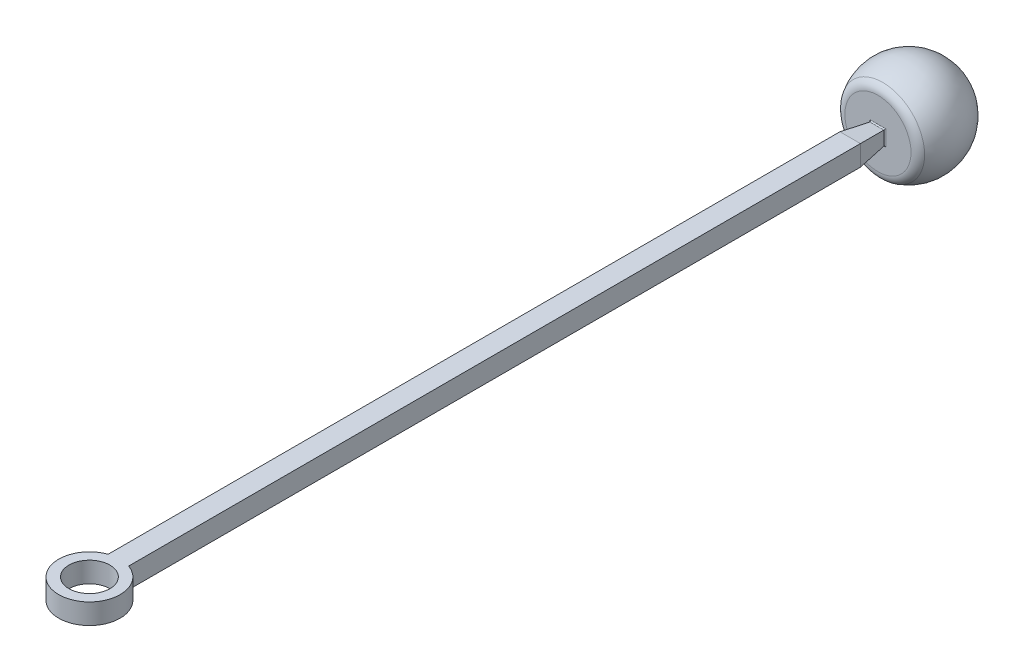
ISO-10303-21;
HEADER;
FILE_DESCRIPTION(('STEP AP214'),'2;1');
FILE_NAME('part.step','',(''),(''),'','','');
FILE_SCHEMA(('AUTOMOTIVE_DESIGN { 1 0 10303 214 1 1 1 1 }'));
ENDSEC;
DATA;
#1=APPLICATION_CONTEXT('core data for automotive mechanical design processes');
#2=APPLICATION_PROTOCOL_DEFINITION('international standard','automotive_design',2000,#1);
#3=PRODUCT_CONTEXT('',#1,'mechanical');
#4=PRODUCT('Part','Part','',(#3));
#5=PRODUCT_RELATED_PRODUCT_CATEGORY('part','',(#4));
#6=PRODUCT_DEFINITION_FORMATION('','',#4);
#7=PRODUCT_DEFINITION_CONTEXT('part definition',#1,'design');
#8=PRODUCT_DEFINITION('design','',#6,#7);
#9=PRODUCT_DEFINITION_SHAPE('','',#8);
#10=(LENGTH_UNIT() NAMED_UNIT(*) SI_UNIT(.MILLI.,.METRE.));
#11=(NAMED_UNIT(*) PLANE_ANGLE_UNIT() SI_UNIT($,.RADIAN.));
#12=(NAMED_UNIT(*) SI_UNIT($,.STERADIAN.) SOLID_ANGLE_UNIT());
#13=UNCERTAINTY_MEASURE_WITH_UNIT(LENGTH_MEASURE(1.E-05),#10,'distance_accuracy_value','');
#14=(GEOMETRIC_REPRESENTATION_CONTEXT(3) GLOBAL_UNCERTAINTY_ASSIGNED_CONTEXT((#13)) GLOBAL_UNIT_ASSIGNED_CONTEXT((#10,
#11,#12)) REPRESENTATION_CONTEXT('',''));
#15=CARTESIAN_POINT('',(0.,0.,0.));
#16=DIRECTION('',(0.,0.,1.));
#17=DIRECTION('',(1.,0.,0.));
#18=AXIS2_PLACEMENT_3D('',#15,#16,#17);
#19=CARTESIAN_POINT('',(5.,-5.,400.));
#20=DIRECTION('',(-1.,0.,0.));
#21=DIRECTION('',(0.,0.,1.));
#22=AXIS2_PLACEMENT_3D('',#19,#20,#21);
#23=PLANE('',#22);
#24=DIRECTION('',(0.,0.,-1.));
#25=VECTOR('',#24,1.);
#26=CARTESIAN_POINT('',(5.,-5.,400.));
#27=LINE('',#26,#25);
#28=CARTESIAN_POINT('',(5.,-5.,385.857864376269));
#29=VERTEX_POINT('',#28);
#30=CARTESIAN_POINT('',(5.,-5.,28.5603368025777));
#31=VERTEX_POINT('',#30);
#32=EDGE_CURVE('E137',#29,#31,#27,.T.);
#33=ORIENTED_EDGE('',*,*,#32,.T.);
#34=DIRECTION('',(0.,1.,0.));
#35=VECTOR('',#34,1.);
#36=CARTESIAN_POINT('',(5.,-5.,28.5603368025777));
#37=LINE('',#36,#35);
#38=CARTESIAN_POINT('',(5.,5.,28.5603368025777));
#39=VERTEX_POINT('',#38);
#40=EDGE_CURVE('E130',#31,#39,#37,.T.);
#41=ORIENTED_EDGE('',*,*,#40,.T.);
#42=DIRECTION('',(0.,0.,-1.));
#43=VECTOR('',#42,1.);
#44=CARTESIAN_POINT('',(5.,5.,400.));
#45=LINE('',#44,#43);
#46=CARTESIAN_POINT('',(5.,5.,385.857864376269));
#47=VERTEX_POINT('',#46);
#48=EDGE_CURVE('E116',#47,#39,#45,.T.);
#49=ORIENTED_EDGE('',*,*,#48,.F.);
#50=DIRECTION('',(0.,1.,0.));
#51=VECTOR('',#50,1.);
#52=CARTESIAN_POINT('',(5.,-47.4264068711929,385.857864376269));
#53=LINE('',#52,#51);
#54=EDGE_CURVE('E140',#47,#29,#53,.F.);
#55=ORIENTED_EDGE('',*,*,#54,.T.);
#56=EDGE_LOOP('',(#33,#41,#49,#55));
#57=FACE_BOUND('',#56,.T.);
#58=ADVANCED_FACE('F37',(#57),#23,.F.);
#59=CARTESIAN_POINT('',(-5.,5.,400.));
#60=DIRECTION('',(0.,-1.,0.));
#61=DIRECTION('',(0.,0.,-1.));
#62=AXIS2_PLACEMENT_3D('',#59,#60,#61);
#63=PLANE('',#62);
#64=CARTESIAN_POINT('',(0.,5.,400.));
#65=DIRECTION('',(0.,1.,0.));
#66=DIRECTION('',(0.,0.,1.));
#67=AXIS2_PLACEMENT_3D('',#64,#65,#66);
#68=CIRCLE('',#67,10.);
#69=CARTESIAN_POINT('',(0.,5.,410.));
#70=VERTEX_POINT('',#69);
#71=EDGE_CURVE('E233',#70,#70,#68,.T.);
#72=ORIENTED_EDGE('',*,*,#71,.F.);
#73=EDGE_LOOP('',(#72));
#74=FACE_BOUND('',#73,.T.);
#75=ORIENTED_EDGE('',*,*,#48,.T.);
#76=DIRECTION('',(-1.,0.,0.));
#77=VECTOR('',#76,1.);
#78=CARTESIAN_POINT('',(-5.,5.,28.5603368025777));
#79=LINE('',#78,#77);
#80=CARTESIAN_POINT('',(-5.,5.,28.5603368025777));
#81=VERTEX_POINT('',#80);
#82=EDGE_CURVE('E230',#39,#81,#79,.T.);
#83=ORIENTED_EDGE('',*,*,#82,.T.);
#84=DIRECTION('',(0.,0.,-1.));
#85=VECTOR('',#84,1.);
#86=CARTESIAN_POINT('',(-5.,5.,400.));
#87=LINE('',#86,#85);
#88=CARTESIAN_POINT('',(-5.,5.,385.857864376269));
#89=VERTEX_POINT('',#88);
#90=EDGE_CURVE('E129',#89,#81,#87,.T.);
#91=ORIENTED_EDGE('',*,*,#90,.F.);
#92=CARTESIAN_POINT('',(0.,5.,400.));
#93=DIRECTION('',(0.,1.,0.));
#94=DIRECTION('',(0.,0.,1.));
#95=AXIS2_PLACEMENT_3D('',#92,#93,#94);
#96=CIRCLE('',#95,15.);
#97=EDGE_CURVE('E239',#89,#47,#96,.T.);
#98=ORIENTED_EDGE('',*,*,#97,.T.);
#99=EDGE_LOOP('',(#75,#83,#91,#98));
#100=FACE_BOUND('',#99,.T.);
#101=ADVANCED_FACE('F187',(#74,#100),#63,.F.);
#102=CARTESIAN_POINT('',(-5.,-5.,400.));
#103=DIRECTION('',(1.,0.,0.));
#104=DIRECTION('',(0.,0.,-1.));
#105=AXIS2_PLACEMENT_3D('',#102,#103,#104);
#106=PLANE('',#105);
#107=ORIENTED_EDGE('',*,*,#90,.T.);
#108=DIRECTION('',(0.,-1.,0.));
#109=VECTOR('',#108,1.);
#110=CARTESIAN_POINT('',(-5.,-5.,28.5603368025777));
#111=LINE('',#110,#109);
#112=CARTESIAN_POINT('',(-5.,-5.,28.5603368025777));
#113=VERTEX_POINT('',#112);
#114=EDGE_CURVE('E120',#81,#113,#111,.T.);
#115=ORIENTED_EDGE('',*,*,#114,.T.);
#116=DIRECTION('',(0.,0.,-1.));
#117=VECTOR('',#116,1.);
#118=CARTESIAN_POINT('',(-5.,-5.,400.));
#119=LINE('',#118,#117);
#120=CARTESIAN_POINT('',(-5.,-5.,385.857864376269));
#121=VERTEX_POINT('',#120);
#122=EDGE_CURVE('E126',#121,#113,#119,.T.);
#123=ORIENTED_EDGE('',*,*,#122,.F.);
#124=DIRECTION('',(0.,1.,0.));
#125=VECTOR('',#124,1.);
#126=CARTESIAN_POINT('',(-5.,-47.4264068711929,385.857864376269));
#127=LINE('',#126,#125);
#128=EDGE_CURVE('E243',#121,#89,#127,.T.);
#129=ORIENTED_EDGE('',*,*,#128,.T.);
#130=EDGE_LOOP('',(#107,#115,#123,#129));
#131=FACE_BOUND('',#130,.T.);
#132=ADVANCED_FACE('F125',(#131),#106,.F.);
#133=CARTESIAN_POINT('',(-5.,-5.,400.));
#134=DIRECTION('',(0.,1.,0.));
#135=DIRECTION('',(0.,0.,1.));
#136=AXIS2_PLACEMENT_3D('',#133,#134,#135);
#137=PLANE('',#136);
#138=CARTESIAN_POINT('',(0.,-5.,400.));
#139=DIRECTION('',(0.,1.,0.));
#140=DIRECTION('',(0.,0.,1.));
#141=AXIS2_PLACEMENT_3D('',#138,#139,#140);
#142=CIRCLE('',#141,10.);
#143=CARTESIAN_POINT('',(0.,-5.,410.));
#144=VERTEX_POINT('',#143);
#145=EDGE_CURVE('E236',#144,#144,#142,.F.);
#146=ORIENTED_EDGE('',*,*,#145,.F.);
#147=EDGE_LOOP('',(#146));
#148=FACE_BOUND('',#147,.T.);
#149=ORIENTED_EDGE('',*,*,#122,.T.);
#150=DIRECTION('',(1.,0.,0.));
#151=VECTOR('',#150,1.);
#152=CARTESIAN_POINT('',(-5.,-5.,28.5603368025777));
#153=LINE('',#152,#151);
#154=EDGE_CURVE('E104',#113,#31,#153,.T.);
#155=ORIENTED_EDGE('',*,*,#154,.T.);
#156=ORIENTED_EDGE('',*,*,#32,.F.);
#157=CARTESIAN_POINT('',(0.,-5.,400.));
#158=DIRECTION('',(0.,1.,0.));
#159=DIRECTION('',(0.,0.,1.));
#160=AXIS2_PLACEMENT_3D('',#157,#158,#159);
#161=CIRCLE('',#160,15.);
#162=EDGE_CURVE('E136',#29,#121,#161,.F.);
#163=ORIENTED_EDGE('',*,*,#162,.T.);
#164=EDGE_LOOP('',(#149,#155,#156,#163));
#165=FACE_BOUND('',#164,.T.);
#166=ADVANCED_FACE('F134',(#148,#165),#137,.F.);
#167=CARTESIAN_POINT('',(0.,-47.4264068711929,400.));
#168=DIRECTION('',(0.,1.,0.));
#169=DIRECTION('',(0.,0.,1.));
#170=AXIS2_PLACEMENT_3D('',#167,#168,#169);
#171=CYLINDRICAL_SURFACE('',#170,15.);
#172=ORIENTED_EDGE('',*,*,#54,.F.);
#173=ORIENTED_EDGE('',*,*,#97,.F.);
#174=ORIENTED_EDGE('',*,*,#128,.F.);
#175=ORIENTED_EDGE('',*,*,#162,.F.);
#176=EDGE_LOOP('',(#172,#173,#174,#175));
#177=FACE_BOUND('',#176,.T.);
#178=ADVANCED_FACE('F247',(#177),#171,.T.);
#179=CARTESIAN_POINT('',(0.,-33.2842712474619,400.));
#180=DIRECTION('',(0.,1.,0.));
#181=DIRECTION('',(0.,0.,1.));
#182=AXIS2_PLACEMENT_3D('',#179,#180,#181);
#183=CYLINDRICAL_SURFACE('',#182,10.);
#184=ORIENTED_EDGE('',*,*,#145,.T.);
#185=EDGE_LOOP('',(#184));
#186=FACE_BOUND('',#185,.T.);
#187=ORIENTED_EDGE('',*,*,#71,.T.);
#188=EDGE_LOOP('',(#187));
#189=FACE_BOUND('',#188,.T.);
#190=ADVANCED_FACE('F257',(#186,#189),#183,.F.);
#191=CARTESIAN_POINT('',(0.,0.,15.));
#192=DIRECTION('',(0.,0.,1.));
#193=DIRECTION('',(1.,0.,0.));
#194=AXIS2_PLACEMENT_3D('',#191,#192,#193);
#195=PLANE('',#194);
#196=CARTESIAN_POINT('',(0.,0.,15.));
#197=DIRECTION('',(0.,0.,1.));
#198=DIRECTION('',(1.,0.,0.));
#199=AXIS2_PLACEMENT_3D('',#196,#197,#198);
#200=CIRCLE('',#199,16.1554944214035);
#201=CARTESIAN_POINT('',(16.1554944214035,0.,15.));
#202=VERTEX_POINT('',#201);
#203=EDGE_CURVE('E45',#202,#202,#200,.T.);
#204=ORIENTED_EDGE('',*,*,#203,.T.);
#205=EDGE_LOOP('',(#204));
#206=FACE_BOUND('',#205,.T.);
#207=DIRECTION('',(-1.,0.,0.));
#208=VECTOR('',#207,1.);
#209=CARTESIAN_POINT('',(0.,3.90014719318088,15.));
#210=LINE('',#209,#208);
#211=CARTESIAN_POINT('',(-3.90014719318088,3.90014719318088,15.));
#212=VERTEX_POINT('',#211);
#213=CARTESIAN_POINT('',(3.90014719318088,3.90014719318088,15.));
#214=VERTEX_POINT('',#213);
#215=EDGE_CURVE('E148',#212,#214,#210,.F.);
#216=ORIENTED_EDGE('',*,*,#215,.T.);
#217=DIRECTION('',(0.,1.,0.));
#218=VECTOR('',#217,1.);
#219=CARTESIAN_POINT('',(3.90014719318088,0.,15.));
#220=LINE('',#219,#218);
#221=CARTESIAN_POINT('',(3.90014719318088,-3.90014719318088,15.));
#222=VERTEX_POINT('',#221);
#223=EDGE_CURVE('E154',#214,#222,#220,.F.);
#224=ORIENTED_EDGE('',*,*,#223,.T.);
#225=DIRECTION('',(1.,0.,0.));
#226=VECTOR('',#225,1.);
#227=CARTESIAN_POINT('',(0.,-3.90014719318088,15.));
#228=LINE('',#227,#226);
#229=CARTESIAN_POINT('',(-3.90014719318088,-3.90014719318088,15.));
#230=VERTEX_POINT('',#229);
#231=EDGE_CURVE('E152',#222,#230,#228,.F.);
#232=ORIENTED_EDGE('',*,*,#231,.T.);
#233=DIRECTION('',(0.,-1.,0.));
#234=VECTOR('',#233,1.);
#235=CARTESIAN_POINT('',(-3.90014719318088,0.,15.));
#236=LINE('',#235,#234);
#237=EDGE_CURVE('E150',#230,#212,#236,.F.);
#238=ORIENTED_EDGE('',*,*,#237,.T.);
#239=EDGE_LOOP('',(#216,#224,#232,#238));
#240=FACE_BOUND('',#239,.T.);
#241=ADVANCED_FACE('F173',(#206,#240),#195,.T.);
#242=CARTESIAN_POINT('',(-3.335,3.335,15.));
#243=DIRECTION('',(0.,-0.992546151641322,0.121869343405148));
#244=DIRECTION('',(0.,-0.121869343405148,-0.992546151641322));
#245=AXIS2_PLACEMENT_3D('',#242,#243,#244);
#246=PLANE('',#245);
#247=DIRECTION('',(-0.120974291151355,-0.120974291151355,-0.985256536015293));
#248=VECTOR('',#247,1.);
#249=CARTESIAN_POINT('',(3.23738602327245,3.23738602327245,14.2049979573186));
#250=LINE('',#249,#248);
#251=CARTESIAN_POINT('',(3.40387411736022,3.40387411736022,15.5609346717026));
#252=VERTEX_POINT('',#251);
#253=EDGE_CURVE('E131',#39,#252,#250,.T.);
#254=ORIENTED_EDGE('',*,*,#253,.T.);
#255=DIRECTION('',(-1.,0.,0.));
#256=VECTOR('',#255,1.);
#257=CARTESIAN_POINT('',(-3.335,3.40387411736022,15.5609346717026));
#258=LINE('',#257,#256);
#259=CARTESIAN_POINT('',(-3.40387411736022,3.40387411736021,15.5609346717026));
#260=VERTEX_POINT('',#259);
#261=EDGE_CURVE('E52',#252,#260,#258,.T.);
#262=ORIENTED_EDGE('',*,*,#261,.T.);
#263=DIRECTION('',(0.120974291151355,-0.120974291151355,-0.985256536015293));
#264=VECTOR('',#263,1.);
#265=CARTESIAN_POINT('',(-3.23738602327245,3.23738602327245,14.2049979573186));
#266=LINE('',#265,#264);
#267=EDGE_CURVE('E121',#81,#260,#266,.T.);
#268=ORIENTED_EDGE('',*,*,#267,.F.);
#269=ORIENTED_EDGE('',*,*,#82,.F.);
#270=EDGE_LOOP('',(#254,#262,#268,#269));
#271=FACE_BOUND('',#270,.T.);
#272=ADVANCED_FACE('F249',(#271),#246,.F.);
#273=CARTESIAN_POINT('',(3.335,-3.335,15.));
#274=DIRECTION('',(-0.992546151641322,0.,0.121869343405148));
#275=DIRECTION('',(0.121869343405148,0.,0.992546151641322));
#276=AXIS2_PLACEMENT_3D('',#273,#274,#275);
#277=PLANE('',#276);
#278=DIRECTION('',(-0.120974291151355,0.120974291151355,-0.985256536015293));
#279=VECTOR('',#278,1.);
#280=CARTESIAN_POINT('',(3.335,-3.335,15.));
#281=LINE('',#280,#279);
#282=CARTESIAN_POINT('',(3.40387411736022,-3.40387411736022,15.5609346717026));
#283=VERTEX_POINT('',#282);
#284=EDGE_CURVE('E109',#31,#283,#281,.T.);
#285=ORIENTED_EDGE('',*,*,#284,.T.);
#286=DIRECTION('',(0.,1.,0.));
#287=VECTOR('',#286,1.);
#288=CARTESIAN_POINT('',(3.40387411736022,-3.335,15.5609346717026));
#289=LINE('',#288,#287);
#290=EDGE_CURVE('E115',#283,#252,#289,.T.);
#291=ORIENTED_EDGE('',*,*,#290,.T.);
#292=ORIENTED_EDGE('',*,*,#253,.F.);
#293=ORIENTED_EDGE('',*,*,#40,.F.);
#294=EDGE_LOOP('',(#285,#291,#292,#293));
#295=FACE_BOUND('',#294,.T.);
#296=ADVANCED_FACE('F222',(#295),#277,.F.);
#297=CARTESIAN_POINT('',(-3.335,-3.335,15.));
#298=DIRECTION('',(0.992546151641322,0.,0.121869343405148));
#299=DIRECTION('',(0.121869343405148,0.,-0.992546151641322));
#300=AXIS2_PLACEMENT_3D('',#297,#298,#299);
#301=PLANE('',#300);
#302=ORIENTED_EDGE('',*,*,#267,.T.);
#303=DIRECTION('',(0.,-1.,0.));
#304=VECTOR('',#303,1.);
#305=CARTESIAN_POINT('',(-3.40387411736022,-3.335,15.5609346717026));
#306=LINE('',#305,#304);
#307=CARTESIAN_POINT('',(-3.40387411736022,-3.40387411736022,15.5609346717026));
#308=VERTEX_POINT('',#307);
#309=EDGE_CURVE('E59',#260,#308,#306,.T.);
#310=ORIENTED_EDGE('',*,*,#309,.T.);
#311=DIRECTION('',(0.120974291151355,0.120974291151355,-0.985256536015293));
#312=VECTOR('',#311,1.);
#313=CARTESIAN_POINT('',(-3.335,-3.335,15.));
#314=LINE('',#313,#312);
#315=EDGE_CURVE('E106',#113,#308,#314,.T.);
#316=ORIENTED_EDGE('',*,*,#315,.F.);
#317=ORIENTED_EDGE('',*,*,#114,.F.);
#318=EDGE_LOOP('',(#302,#310,#316,#317));
#319=FACE_BOUND('',#318,.T.);
#320=ADVANCED_FACE('F119',(#319),#301,.F.);
#321=CARTESIAN_POINT('',(-3.335,-3.335,15.));
#322=DIRECTION('',(0.,0.992546151641322,0.121869343405148));
#323=DIRECTION('',(0.,-0.121869343405148,0.992546151641322));
#324=AXIS2_PLACEMENT_3D('',#321,#322,#323);
#325=PLANE('',#324);
#326=ORIENTED_EDGE('',*,*,#315,.T.);
#327=DIRECTION('',(1.,0.,0.));
#328=VECTOR('',#327,1.);
#329=CARTESIAN_POINT('',(-3.335,-3.40387411736022,15.5609346717026));
#330=LINE('',#329,#328);
#331=EDGE_CURVE('E157',#308,#283,#330,.T.);
#332=ORIENTED_EDGE('',*,*,#331,.T.);
#333=ORIENTED_EDGE('',*,*,#284,.F.);
#334=ORIENTED_EDGE('',*,*,#154,.F.);
#335=EDGE_LOOP('',(#326,#332,#333,#334));
#336=FACE_BOUND('',#335,.T.);
#337=ADVANCED_FACE('F105',(#336),#325,.F.);
#338=CARTESIAN_POINT('',(0.,0.,0.));
#339=DIRECTION('',(0.,1.,0.));
#340=DIRECTION('',(1.,0.,0.));
#341=AXIS2_PLACEMENT_3D('',#338,#339,#340);
#342=SPHERICAL_SURFACE('',#341,24.);
#343=CARTESIAN_POINT('',(0.,0.,0.));
#344=DIRECTION('',(0.,0.,-1.));
#345=DIRECTION('',(-1.,0.,0.));
#346=AXIS2_PLACEMENT_3D('',#343,#344,#345);
#347=SPHERICAL_SURFACE('',#346,24.);
#348=CARTESIAN_POINT('',(0.,0.,12.6315789473684));
#349=DIRECTION('',(0.,0.,-1.));
#350=DIRECTION('',(-1.,0.,0.));
#351=AXIS2_PLACEMENT_3D('',#348,#349,#350);
#352=CIRCLE('',#351,20.4069403217729);
#353=CARTESIAN_POINT('',(-20.4069403217729,0.,12.6315789473684));
#354=VERTEX_POINT('',#353);
#355=EDGE_CURVE('E12',#354,#354,#352,.T.);
#356=ORIENTED_EDGE('',*,*,#355,.T.);
#357=EDGE_LOOP('',(#356));
#358=FACE_BOUND('',#357,.T.);
#359=ADVANCED_FACE('F197',(#358),#347,.T.);
#360=CARTESIAN_POINT('',(-3.90014719318088,-3.335,15.5));
#361=DIRECTION('',(0.,-1.,0.));
#362=DIRECTION('',(0.,0.,-1.));
#363=AXIS2_PLACEMENT_3D('',#360,#361,#362);
#364=CYLINDRICAL_SURFACE('',#363,0.5);
#365=CARTESIAN_POINT('',(-3.90014719318088,3.90014719318088,15.5));
#366=DIRECTION('',(-0.707106781186547,-0.707106781186547,0.));
#367=DIRECTION('',(-0.707106781186547,0.707106781186547,0.));
#368=AXIS2_PLACEMENT_3D('',#365,#366,#367);
#369=ELLIPSE('',#368,0.707106781186547,0.5);
#370=EDGE_CURVE('E165',#212,#260,#369,.T.);
#371=ORIENTED_EDGE('',*,*,#370,.F.);
#372=ORIENTED_EDGE('',*,*,#237,.F.);
#373=CARTESIAN_POINT('',(-3.90014719318088,-3.90014719318088,15.5));
#374=DIRECTION('',(0.707106781186547,-0.707106781186547,0.));
#375=DIRECTION('',(-0.707106781186547,-0.707106781186547,0.));
#376=AXIS2_PLACEMENT_3D('',#373,#374,#375);
#377=ELLIPSE('',#376,0.707106781186547,0.5);
#378=EDGE_CURVE('E168',#308,#230,#377,.F.);
#379=ORIENTED_EDGE('',*,*,#378,.F.);
#380=ORIENTED_EDGE('',*,*,#309,.F.);
#381=EDGE_LOOP('',(#371,#372,#379,#380));
#382=FACE_BOUND('',#381,.T.);
#383=ADVANCED_FACE('F199',(#382),#364,.F.);
#384=CARTESIAN_POINT('',(-3.335,-3.90014719318088,15.5));
#385=DIRECTION('',(1.,0.,0.));
#386=DIRECTION('',(0.,0.,-1.));
#387=AXIS2_PLACEMENT_3D('',#384,#385,#386);
#388=CYLINDRICAL_SURFACE('',#387,0.5);
#389=ORIENTED_EDGE('',*,*,#378,.T.);
#390=ORIENTED_EDGE('',*,*,#231,.F.);
#391=CARTESIAN_POINT('',(3.90014719318088,-3.90014719318088,15.5));
#392=DIRECTION('',(0.707106781186547,0.707106781186547,0.));
#393=DIRECTION('',(0.707106781186547,-0.707106781186547,0.));
#394=AXIS2_PLACEMENT_3D('',#391,#392,#393);
#395=ELLIPSE('',#394,0.707106781186547,0.5);
#396=EDGE_CURVE('E163',#283,#222,#395,.F.);
#397=ORIENTED_EDGE('',*,*,#396,.F.);
#398=ORIENTED_EDGE('',*,*,#331,.F.);
#399=EDGE_LOOP('',(#389,#390,#397,#398));
#400=FACE_BOUND('',#399,.T.);
#401=ADVANCED_FACE('F204',(#400),#388,.F.);
#402=CARTESIAN_POINT('',(-3.335,3.90014719318088,15.5));
#403=DIRECTION('',(-1.,0.,0.));
#404=DIRECTION('',(0.,0.,1.));
#405=AXIS2_PLACEMENT_3D('',#402,#403,#404);
#406=CYLINDRICAL_SURFACE('',#405,0.5);
#407=ORIENTED_EDGE('',*,*,#370,.T.);
#408=ORIENTED_EDGE('',*,*,#261,.F.);
#409=CARTESIAN_POINT('',(3.90014719318088,3.90014719318088,15.5));
#410=DIRECTION('',(-0.707106781186547,0.707106781186547,0.));
#411=DIRECTION('',(-0.707106781186547,-0.707106781186547,0.));
#412=AXIS2_PLACEMENT_3D('',#409,#410,#411);
#413=ELLIPSE('',#412,0.707106781186547,0.5);
#414=EDGE_CURVE('E161',#214,#252,#413,.T.);
#415=ORIENTED_EDGE('',*,*,#414,.F.);
#416=ORIENTED_EDGE('',*,*,#215,.F.);
#417=EDGE_LOOP('',(#407,#408,#415,#416));
#418=FACE_BOUND('',#417,.T.);
#419=ADVANCED_FACE('F182',(#418),#406,.F.);
#420=CARTESIAN_POINT('',(3.90014719318088,-3.335,15.5));
#421=DIRECTION('',(0.,1.,0.));
#422=DIRECTION('',(0.,0.,1.));
#423=AXIS2_PLACEMENT_3D('',#420,#421,#422);
#424=CYLINDRICAL_SURFACE('',#423,0.5);
#425=ORIENTED_EDGE('',*,*,#396,.T.);
#426=ORIENTED_EDGE('',*,*,#223,.F.);
#427=ORIENTED_EDGE('',*,*,#414,.T.);
#428=ORIENTED_EDGE('',*,*,#290,.F.);
#429=EDGE_LOOP('',(#425,#426,#427,#428));
#430=FACE_BOUND('',#429,.T.);
#431=ADVANCED_FACE('F177',(#430),#424,.F.);
#432=CARTESIAN_POINT('',(0.,0.,10.));
#433=DIRECTION('',(0.,0.,1.));
#434=DIRECTION('',(1.,0.,0.));
#435=AXIS2_PLACEMENT_3D('',#432,#433,#434);
#436=TOROIDAL_SURFACE('',#435,16.1554944214035,5.);
#437=ORIENTED_EDGE('',*,*,#355,.F.);
#438=EDGE_LOOP('',(#437));
#439=FACE_BOUND('',#438,.T.);
#440=ORIENTED_EDGE('',*,*,#203,.F.);
#441=EDGE_LOOP('',(#440));
#442=FACE_BOUND('',#441,.T.);
#443=ADVANCED_FACE('F39',(#439,#442),#436,.T.);
#444=CLOSED_SHELL('',(#58,#101,#132,#166,#178,#190,#241,#272,#296,#320,#337,#359,#383,#401,#419,
#431,#443));
#445=MANIFOLD_SOLID_BREP('B2',#444);
#446=ADVANCED_BREP_SHAPE_REPRESENTATION('',(#18,#445),#14);
#447=SHAPE_DEFINITION_REPRESENTATION(#9,#446);
ENDSEC;
END-ISO-10303-21;
